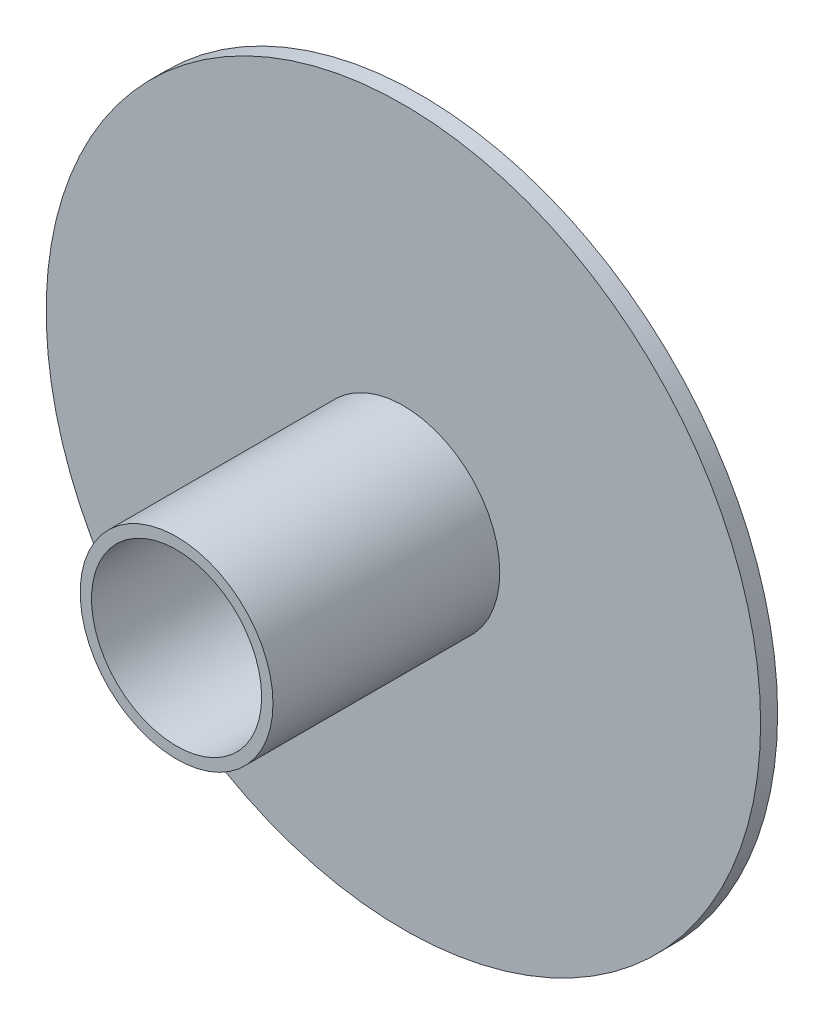
ISO-10303-21;
HEADER;
FILE_DESCRIPTION(('STEP AP214'),'2;1');
FILE_NAME('part.step','',(''),(''),'','','');
FILE_SCHEMA(('AUTOMOTIVE_DESIGN { 1 0 10303 214 1 1 1 1 }'));
ENDSEC;
DATA;
#1=APPLICATION_CONTEXT('core data for automotive mechanical design processes');
#2=APPLICATION_PROTOCOL_DEFINITION('international standard','automotive_design',2000,#1);
#3=PRODUCT_CONTEXT('',#1,'mechanical');
#4=PRODUCT('Part','Part','',(#3));
#5=PRODUCT_RELATED_PRODUCT_CATEGORY('part','',(#4));
#6=PRODUCT_DEFINITION_FORMATION('','',#4);
#7=PRODUCT_DEFINITION_CONTEXT('part definition',#1,'design');
#8=PRODUCT_DEFINITION('design','',#6,#7);
#9=PRODUCT_DEFINITION_SHAPE('','',#8);
#10=(LENGTH_UNIT() NAMED_UNIT(*) SI_UNIT(.MILLI.,.METRE.));
#11=(NAMED_UNIT(*) PLANE_ANGLE_UNIT() SI_UNIT($,.RADIAN.));
#12=(NAMED_UNIT(*) SI_UNIT($,.STERADIAN.) SOLID_ANGLE_UNIT());
#13=UNCERTAINTY_MEASURE_WITH_UNIT(LENGTH_MEASURE(1.E-05),#10,'distance_accuracy_value','');
#14=(GEOMETRIC_REPRESENTATION_CONTEXT(3) GLOBAL_UNCERTAINTY_ASSIGNED_CONTEXT((#13)) GLOBAL_UNIT_ASSIGNED_CONTEXT((#10,
#11,#12)) REPRESENTATION_CONTEXT('',''));
#15=CARTESIAN_POINT('',(0.,0.,0.));
#16=DIRECTION('',(0.,0.,1.));
#17=DIRECTION('',(1.,0.,0.));
#18=AXIS2_PLACEMENT_3D('',#15,#16,#17);
#19=CARTESIAN_POINT('',(0.,0.,1.5));
#20=DIRECTION('',(0.,0.,-1.));
#21=DIRECTION('',(-1.,0.,0.));
#22=AXIS2_PLACEMENT_3D('',#19,#20,#21);
#23=CYLINDRICAL_SURFACE('',#22,31.5);
#24=CARTESIAN_POINT('',(0.,0.,1.5));
#25=DIRECTION('',(0.,0.,1.));
#26=DIRECTION('',(1.,0.,0.));
#27=AXIS2_PLACEMENT_3D('',#24,#25,#26);
#28=CIRCLE('',#27,31.5);
#29=CARTESIAN_POINT('',(31.5,0.,1.5));
#30=VERTEX_POINT('',#29);
#31=EDGE_CURVE('E10',#30,#30,#28,.T.);
#32=ORIENTED_EDGE('',*,*,#31,.F.);
#33=EDGE_LOOP('',(#32));
#34=FACE_BOUND('',#33,.T.);
#35=CARTESIAN_POINT('',(0.,0.,0.));
#36=DIRECTION('',(0.,0.,1.));
#37=DIRECTION('',(1.,0.,0.));
#38=AXIS2_PLACEMENT_3D('',#35,#36,#37);
#39=CIRCLE('',#38,31.5);
#40=CARTESIAN_POINT('',(31.5,0.,0.));
#41=VERTEX_POINT('',#40);
#42=EDGE_CURVE('E38',#41,#41,#39,.T.);
#43=ORIENTED_EDGE('',*,*,#42,.T.);
#44=EDGE_LOOP('',(#43));
#45=FACE_BOUND('',#44,.T.);
#46=ADVANCED_FACE('F31',(#34,#45),#23,.T.);
#47=CARTESIAN_POINT('',(0.,0.,1.5));
#48=DIRECTION('',(0.,0.,1.));
#49=DIRECTION('',(1.,0.,0.));
#50=AXIS2_PLACEMENT_3D('',#47,#48,#49);
#51=PLANE('',#50);
#52=CARTESIAN_POINT('',(0.,0.,1.5));
#53=DIRECTION('',(0.,0.,1.));
#54=DIRECTION('',(1.,0.,0.));
#55=AXIS2_PLACEMENT_3D('',#52,#53,#54);
#56=CIRCLE('',#55,8.5);
#57=CARTESIAN_POINT('',(8.5,0.,1.5));
#58=VERTEX_POINT('',#57);
#59=EDGE_CURVE('E45',#58,#58,#56,.T.);
#60=ORIENTED_EDGE('',*,*,#59,.F.);
#61=EDGE_LOOP('',(#60));
#62=FACE_BOUND('',#61,.T.);
#63=ORIENTED_EDGE('',*,*,#31,.T.);
#64=EDGE_LOOP('',(#63));
#65=FACE_BOUND('',#64,.T.);
#66=ADVANCED_FACE('F73',(#62,#65),#51,.T.);
#67=CARTESIAN_POINT('',(0.,0.,0.));
#68=DIRECTION('',(0.,0.,1.));
#69=DIRECTION('',(1.,0.,0.));
#70=AXIS2_PLACEMENT_3D('',#67,#68,#69);
#71=PLANE('',#70);
#72=CARTESIAN_POINT('',(0.,0.,0.));
#73=DIRECTION('',(0.,0.,1.));
#74=DIRECTION('',(1.,0.,0.));
#75=AXIS2_PLACEMENT_3D('',#72,#73,#74);
#76=CIRCLE('',#75,7.5);
#77=CARTESIAN_POINT('',(7.5,0.,0.));
#78=VERTEX_POINT('',#77);
#79=EDGE_CURVE('E50',#78,#78,#76,.T.);
#80=ORIENTED_EDGE('',*,*,#79,.T.);
#81=EDGE_LOOP('',(#80));
#82=FACE_BOUND('',#81,.T.);
#83=ORIENTED_EDGE('',*,*,#42,.F.);
#84=EDGE_LOOP('',(#83));
#85=FACE_BOUND('',#84,.T.);
#86=ADVANCED_FACE('F69',(#82,#85),#71,.F.);
#87=CARTESIAN_POINT('',(0.,0.,21.5));
#88=DIRECTION('',(0.,0.,-1.));
#89=DIRECTION('',(-1.,0.,0.));
#90=AXIS2_PLACEMENT_3D('',#87,#88,#89);
#91=CYLINDRICAL_SURFACE('',#90,8.5);
#92=CARTESIAN_POINT('',(0.,0.,21.5));
#93=DIRECTION('',(0.,0.,1.));
#94=DIRECTION('',(1.,0.,0.));
#95=AXIS2_PLACEMENT_3D('',#92,#93,#94);
#96=CIRCLE('',#95,8.5);
#97=CARTESIAN_POINT('',(8.5,0.,21.5));
#98=VERTEX_POINT('',#97);
#99=EDGE_CURVE('E43',#98,#98,#96,.T.);
#100=ORIENTED_EDGE('',*,*,#99,.F.);
#101=EDGE_LOOP('',(#100));
#102=FACE_BOUND('',#101,.T.);
#103=ORIENTED_EDGE('',*,*,#59,.T.);
#104=EDGE_LOOP('',(#103));
#105=FACE_BOUND('',#104,.T.);
#106=ADVANCED_FACE('F63',(#102,#105),#91,.T.);
#107=CARTESIAN_POINT('',(0.,0.,21.5));
#108=DIRECTION('',(0.,0.,1.));
#109=DIRECTION('',(1.,0.,0.));
#110=AXIS2_PLACEMENT_3D('',#107,#108,#109);
#111=PLANE('',#110);
#112=CARTESIAN_POINT('',(0.,0.,21.5));
#113=DIRECTION('',(0.,0.,1.));
#114=DIRECTION('',(1.,0.,0.));
#115=AXIS2_PLACEMENT_3D('',#112,#113,#114);
#116=CIRCLE('',#115,7.5);
#117=CARTESIAN_POINT('',(7.5,0.,21.5));
#118=VERTEX_POINT('',#117);
#119=EDGE_CURVE('E34',#118,#118,#116,.T.);
#120=ORIENTED_EDGE('',*,*,#119,.F.);
#121=EDGE_LOOP('',(#120));
#122=FACE_BOUND('',#121,.T.);
#123=ORIENTED_EDGE('',*,*,#99,.T.);
#124=EDGE_LOOP('',(#123));
#125=FACE_BOUND('',#124,.T.);
#126=ADVANCED_FACE('F60',(#122,#125),#111,.T.);
#127=CARTESIAN_POINT('',(0.,0.,0.));
#128=DIRECTION('',(0.,0.,1.));
#129=DIRECTION('',(1.,0.,0.));
#130=AXIS2_PLACEMENT_3D('',#127,#128,#129);
#131=CYLINDRICAL_SURFACE('',#130,7.5);
#132=ORIENTED_EDGE('',*,*,#119,.T.);
#133=EDGE_LOOP('',(#132));
#134=FACE_BOUND('',#133,.T.);
#135=ORIENTED_EDGE('',*,*,#79,.F.);
#136=EDGE_LOOP('',(#135));
#137=FACE_BOUND('',#136,.T.);
#138=ADVANCED_FACE('F57',(#134,#137),#131,.F.);
#139=CLOSED_SHELL('',(#46,#66,#86,#106,#126,#138));
#140=MANIFOLD_SOLID_BREP('B2',#139);
#141=ADVANCED_BREP_SHAPE_REPRESENTATION('',(#18,#140),#14);
#142=SHAPE_DEFINITION_REPRESENTATION(#9,#141);
ENDSEC;
END-ISO-10303-21;
